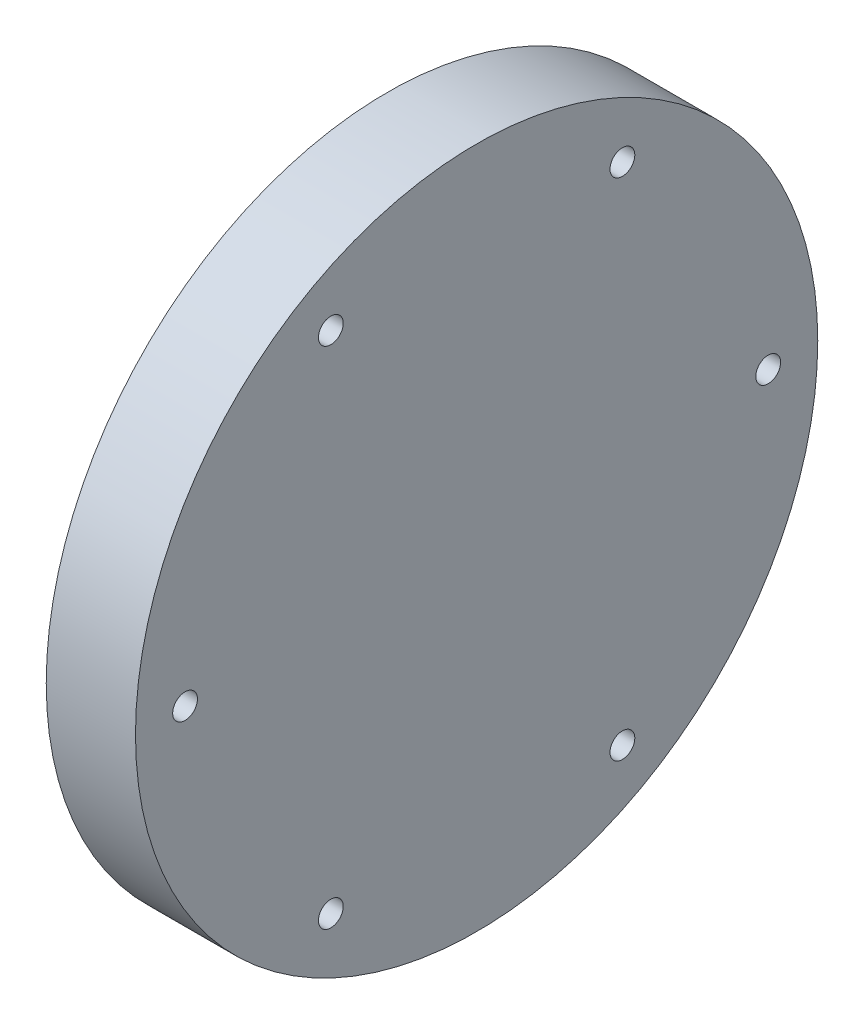
ISO-10303-21;
HEADER;
FILE_DESCRIPTION(('STEP AP214'),'2;1');
FILE_NAME('part.step','',(''),(''),'','','');
FILE_SCHEMA(('AUTOMOTIVE_DESIGN { 1 0 10303 214 1 1 1 1 }'));
ENDSEC;
DATA;
#1=APPLICATION_CONTEXT('core data for automotive mechanical design processes');
#2=APPLICATION_PROTOCOL_DEFINITION('international standard','automotive_design',2000,#1);
#3=PRODUCT_CONTEXT('',#1,'mechanical');
#4=PRODUCT('Part','Part','',(#3));
#5=PRODUCT_RELATED_PRODUCT_CATEGORY('part','',(#4));
#6=PRODUCT_DEFINITION_FORMATION('','',#4);
#7=PRODUCT_DEFINITION_CONTEXT('part definition',#1,'design');
#8=PRODUCT_DEFINITION('design','',#6,#7);
#9=PRODUCT_DEFINITION_SHAPE('','',#8);
#10=(LENGTH_UNIT() NAMED_UNIT(*) SI_UNIT(.MILLI.,.METRE.));
#11=(NAMED_UNIT(*) PLANE_ANGLE_UNIT() SI_UNIT($,.RADIAN.));
#12=(NAMED_UNIT(*) SI_UNIT($,.STERADIAN.) SOLID_ANGLE_UNIT());
#13=UNCERTAINTY_MEASURE_WITH_UNIT(LENGTH_MEASURE(1.E-05),#10,'distance_accuracy_value','');
#14=(GEOMETRIC_REPRESENTATION_CONTEXT(3) GLOBAL_UNCERTAINTY_ASSIGNED_CONTEXT((#13)) GLOBAL_UNIT_ASSIGNED_CONTEXT((#10,
#11,#12)) REPRESENTATION_CONTEXT('',''));
#15=CARTESIAN_POINT('',(0.,0.,0.));
#16=DIRECTION('',(0.,0.,1.));
#17=DIRECTION('',(1.,0.,0.));
#18=AXIS2_PLACEMENT_3D('',#15,#16,#17);
#19=CARTESIAN_POINT('',(159.7,-25.46114687126,-14.7));
#20=DIRECTION('',(1.,0.,0.));
#21=DIRECTION('',(0.,0.,1.));
#22=AXIS2_PLACEMENT_3D('',#19,#20,#21);
#23=CYLINDRICAL_SURFACE('',#22,1.65);
#24=DIRECTION('',(1.,0.,0.));
#25=VECTOR('',#24,1.);
#26=CARTESIAN_POINT('',(159.7,-25.46114687126,-13.05));
#27=LINE('',#26,#25);
#28=CARTESIAN_POINT('',(159.7,-25.46114687126,-13.05));
#29=VERTEX_POINT('',#28);
#30=CARTESIAN_POINT('',(163.7,-25.46114687126,-13.05));
#31=VERTEX_POINT('',#30);
#32=EDGE_CURVE('E62',#29,#31,#27,.T.);
#33=ORIENTED_EDGE('',*,*,#32,.F.);
#34=CARTESIAN_POINT('',(159.7,-25.46114687126,-14.7));
#35=DIRECTION('',(1.,0.,0.));
#36=DIRECTION('',(0.,0.,1.));
#37=AXIS2_PLACEMENT_3D('',#34,#35,#36);
#38=CIRCLE('',#37,1.65);
#39=EDGE_CURVE('E189',#29,#29,#38,.T.);
#40=ORIENTED_EDGE('',*,*,#39,.F.);
#41=ORIENTED_EDGE('',*,*,#32,.T.);
#42=CARTESIAN_POINT('',(163.7,-25.46114687126,-14.7));
#43=DIRECTION('',(1.,0.,0.));
#44=DIRECTION('',(0.,0.,1.));
#45=AXIS2_PLACEMENT_3D('',#42,#43,#44);
#46=CIRCLE('',#45,1.65);
#47=EDGE_CURVE('E158',#31,#31,#46,.T.);
#48=ORIENTED_EDGE('',*,*,#47,.T.);
#49=EDGE_LOOP('',(#33,#40,#41,#48));
#50=FACE_BOUND('',#49,.T.);
#51=ADVANCED_FACE('F40',(#50),#23,.F.);
#52=CARTESIAN_POINT('',(159.7,0.,29.4));
#53=DIRECTION('',(1.,0.,0.));
#54=DIRECTION('',(0.,0.,1.));
#55=AXIS2_PLACEMENT_3D('',#52,#53,#54);
#56=CYLINDRICAL_SURFACE('',#55,1.65);
#57=DIRECTION('',(1.,0.,0.));
#58=VECTOR('',#57,1.);
#59=CARTESIAN_POINT('',(159.7,0.,31.05));
#60=LINE('',#59,#58);
#61=CARTESIAN_POINT('',(159.7,0.,31.05));
#62=VERTEX_POINT('',#61);
#63=CARTESIAN_POINT('',(163.7,0.,31.05));
#64=VERTEX_POINT('',#63);
#65=EDGE_CURVE('E134',#62,#64,#60,.T.);
#66=ORIENTED_EDGE('',*,*,#65,.F.);
#67=CARTESIAN_POINT('',(159.7,0.,29.4));
#68=DIRECTION('',(1.,0.,0.));
#69=DIRECTION('',(0.,0.,1.));
#70=AXIS2_PLACEMENT_3D('',#67,#68,#69);
#71=CIRCLE('',#70,1.65);
#72=EDGE_CURVE('E186',#62,#62,#71,.T.);
#73=ORIENTED_EDGE('',*,*,#72,.F.);
#74=ORIENTED_EDGE('',*,*,#65,.T.);
#75=CARTESIAN_POINT('',(163.7,0.,29.4));
#76=DIRECTION('',(1.,0.,0.));
#77=DIRECTION('',(0.,0.,1.));
#78=AXIS2_PLACEMENT_3D('',#75,#76,#77);
#79=CIRCLE('',#78,1.65);
#80=EDGE_CURVE('E156',#64,#64,#79,.T.);
#81=ORIENTED_EDGE('',*,*,#80,.T.);
#82=EDGE_LOOP('',(#66,#73,#74,#81));
#83=FACE_BOUND('',#82,.T.);
#84=ADVANCED_FACE('F251',(#83),#56,.F.);
#85=CARTESIAN_POINT('',(159.7,0.,0.));
#86=DIRECTION('',(-1.,0.,0.));
#87=DIRECTION('',(0.,0.938443783091679,0.345431999062881));
#88=AXIS2_PLACEMENT_3D('',#85,#86,#87);
#89=CYLINDRICAL_SURFACE('',#88,10.4);
#90=DIRECTION('',(1.,0.,0.));
#91=VECTOR('',#90,1.);
#92=CARTESIAN_POINT('',(159.7,9.759815344154,3.592492790253));
#93=LINE('',#92,#91);
#94=CARTESIAN_POINT('',(159.7,9.759815344154,3.592492790253));
#95=VERTEX_POINT('',#94);
#96=CARTESIAN_POINT('',(163.7,9.759815344154,3.592492790253));
#97=VERTEX_POINT('',#96);
#98=EDGE_CURVE('E126',#95,#97,#93,.T.);
#99=ORIENTED_EDGE('',*,*,#98,.T.);
#100=CARTESIAN_POINT('',(163.7,0.,0.));
#101=DIRECTION('',(-1.,0.,0.));
#102=DIRECTION('',(0.,0.938443783091679,0.345431999062881));
#103=AXIS2_PLACEMENT_3D('',#100,#101,#102);
#104=CIRCLE('',#103,10.4);
#105=CARTESIAN_POINT('',(163.7,9.441507626331,4.360955599628));
#106=VERTEX_POINT('',#105);
#107=EDGE_CURVE('E110',#97,#106,#104,.T.);
#108=ORIENTED_EDGE('',*,*,#107,.T.);
#109=DIRECTION('',(1.,0.,0.));
#110=VECTOR('',#109,1.);
#111=CARTESIAN_POINT('',(159.7,9.441507626331,4.360955599628));
#112=LINE('',#111,#110);
#113=CARTESIAN_POINT('',(159.7,9.441507626331,4.360955599628));
#114=VERTEX_POINT('',#113);
#115=EDGE_CURVE('E135',#114,#106,#112,.T.);
#116=ORIENTED_EDGE('',*,*,#115,.F.);
#117=CARTESIAN_POINT('',(159.7,0.,0.));
#118=DIRECTION('',(-1.,0.,0.));
#119=DIRECTION('',(0.,0.938443783091679,0.345431999062881));
#120=AXIS2_PLACEMENT_3D('',#117,#118,#119);
#121=CIRCLE('',#120,10.4);
#122=EDGE_CURVE('E129',#95,#114,#121,.T.);
#123=ORIENTED_EDGE('',*,*,#122,.F.);
#124=EDGE_LOOP('',(#99,#108,#116,#123));
#125=FACE_BOUND('',#124,.T.);
#126=ADVANCED_FACE('F127',(#125),#89,.T.);
#127=CARTESIAN_POINT('',(159.7,23.461094577293,8.63579997657));
#128=DIRECTION('',(0.,0.345431999062881,-0.938443783091679));
#129=DIRECTION('',(-1.,0.,0.));
#130=AXIS2_PLACEMENT_3D('',#127,#128,#129);
#131=PLANE('',#130);
#132=DIRECTION('',(1.,0.,0.));
#133=VECTOR('',#132,1.);
#134=CARTESIAN_POINT('',(159.7,23.461094577293,8.63579997657));
#135=LINE('',#134,#133);
#136=CARTESIAN_POINT('',(159.7,23.461094577293,8.63579997657));
#137=VERTEX_POINT('',#136);
#138=CARTESIAN_POINT('',(163.7,23.461094577293,8.63579997657));
#139=VERTEX_POINT('',#138);
#140=EDGE_CURVE('E138',#137,#139,#135,.T.);
#141=ORIENTED_EDGE('',*,*,#140,.T.);
#142=DIRECTION('',(0.,-0.938443783091679,-0.345431999062881));
#143=VECTOR('',#142,1.);
#144=CARTESIAN_POINT('',(163.7,23.461094577293,8.63579997657));
#145=LINE('',#144,#143);
#146=EDGE_CURVE('E116',#139,#97,#145,.T.);
#147=ORIENTED_EDGE('',*,*,#146,.T.);
#148=ORIENTED_EDGE('',*,*,#98,.F.);
#149=DIRECTION('',(0.,-0.938443783091679,-0.345431999062881));
#150=VECTOR('',#149,1.);
#151=CARTESIAN_POINT('',(159.7,23.461094577293,8.63579997657));
#152=LINE('',#151,#150);
#153=EDGE_CURVE('E43',#137,#95,#152,.T.);
#154=ORIENTED_EDGE('',*,*,#153,.F.);
#155=EDGE_LOOP('',(#141,#147,#148,#154));
#156=FACE_BOUND('',#155,.T.);
#157=ADVANCED_FACE('F137',(#156),#131,.T.);
#158=CARTESIAN_POINT('',(159.7,9.441507626331,4.360955599628));
#159=DIRECTION('',(0.,-0.419322653809927,0.907837271762842));
#160=DIRECTION('',(-1.,0.,0.));
#161=AXIS2_PLACEMENT_3D('',#158,#159,#160);
#162=PLANE('',#161);
#163=ORIENTED_EDGE('',*,*,#115,.T.);
#164=DIRECTION('',(0.,0.907837271762842,0.419322653809927));
#165=VECTOR('',#164,1.);
#166=CARTESIAN_POINT('',(163.7,9.441507626331,4.360955599628));
#167=LINE('',#166,#165);
#168=CARTESIAN_POINT('',(163.7,22.695931794066,10.483066345259));
#169=VERTEX_POINT('',#168);
#170=EDGE_CURVE('E120',#106,#169,#167,.T.);
#171=ORIENTED_EDGE('',*,*,#170,.T.);
#172=DIRECTION('',(1.,0.,0.));
#173=VECTOR('',#172,1.);
#174=CARTESIAN_POINT('',(159.7,22.695931794066,10.483066345259));
#175=LINE('',#174,#173);
#176=CARTESIAN_POINT('',(159.7,22.695931794066,10.483066345259));
#177=VERTEX_POINT('',#176);
#178=EDGE_CURVE('E162',#177,#169,#175,.T.);
#179=ORIENTED_EDGE('',*,*,#178,.F.);
#180=DIRECTION('',(0.,0.907837271762842,0.419322653809927));
#181=VECTOR('',#180,1.);
#182=CARTESIAN_POINT('',(159.7,9.441507626331,4.360955599628));
#183=LINE('',#182,#181);
#184=EDGE_CURVE('E181',#114,#177,#183,.T.);
#185=ORIENTED_EDGE('',*,*,#184,.F.);
#186=EDGE_LOOP('',(#163,#171,#179,#185));
#187=FACE_BOUND('',#186,.T.);
#188=ADVANCED_FACE('F217',(#187),#162,.T.);
#189=CARTESIAN_POINT('',(159.7,0.,-1.265654248073E-13));
#190=DIRECTION('',(-1.,0.,0.));
#191=DIRECTION('',(0.,0.907837271762842,0.419322653809927));
#192=AXIS2_PLACEMENT_3D('',#189,#190,#191);
#193=CYLINDRICAL_SURFACE('',#192,25.);
#194=ORIENTED_EDGE('',*,*,#178,.T.);
#195=CARTESIAN_POINT('',(163.7,0.,-1.265654248073E-13));
#196=DIRECTION('',(1.,0.,0.));
#197=DIRECTION('',(0.,0.907837271762842,0.419322653809927));
#198=AXIS2_PLACEMENT_3D('',#195,#196,#197);
#199=CIRCLE('',#198,25.);
#200=EDGE_CURVE('E169',#169,#139,#199,.T.);
#201=ORIENTED_EDGE('',*,*,#200,.T.);
#202=ORIENTED_EDGE('',*,*,#140,.F.);
#203=CARTESIAN_POINT('',(159.7,0.,-1.265654248073E-13));
#204=DIRECTION('',(1.,0.,0.));
#205=DIRECTION('',(0.,0.907837271762842,0.419322653809927));
#206=AXIS2_PLACEMENT_3D('',#203,#204,#205);
#207=CIRCLE('',#206,25.);
#208=EDGE_CURVE('E185',#177,#137,#207,.T.);
#209=ORIENTED_EDGE('',*,*,#208,.F.);
#210=EDGE_LOOP('',(#194,#201,#202,#209));
#211=FACE_BOUND('',#210,.T.);
#212=ADVANCED_FACE('F246',(#211),#193,.F.);
#213=CARTESIAN_POINT('',(159.7,25.461146871262,-14.7));
#214=DIRECTION('',(1.,0.,0.));
#215=DIRECTION('',(0.,0.,1.));
#216=AXIS2_PLACEMENT_3D('',#213,#214,#215);
#217=CYLINDRICAL_SURFACE('',#216,1.65);
#218=DIRECTION('',(1.,0.,0.));
#219=VECTOR('',#218,1.);
#220=CARTESIAN_POINT('',(159.7,25.461146871262,-13.05));
#221=LINE('',#220,#219);
#222=CARTESIAN_POINT('',(159.7,25.461146871262,-13.05));
#223=VERTEX_POINT('',#222);
#224=CARTESIAN_POINT('',(163.7,25.461146871262,-13.05));
#225=VERTEX_POINT('',#224);
#226=EDGE_CURVE('E165',#223,#225,#221,.T.);
#227=ORIENTED_EDGE('',*,*,#226,.F.);
#228=CARTESIAN_POINT('',(159.7,25.461146871262,-14.7));
#229=DIRECTION('',(1.,0.,0.));
#230=DIRECTION('',(0.,0.,1.));
#231=AXIS2_PLACEMENT_3D('',#228,#229,#230);
#232=CIRCLE('',#231,1.65);
#233=EDGE_CURVE('E141',#223,#223,#232,.T.);
#234=ORIENTED_EDGE('',*,*,#233,.F.);
#235=ORIENTED_EDGE('',*,*,#226,.T.);
#236=CARTESIAN_POINT('',(163.7,25.461146871262,-14.7));
#237=DIRECTION('',(1.,0.,0.));
#238=DIRECTION('',(0.,0.,1.));
#239=AXIS2_PLACEMENT_3D('',#236,#237,#238);
#240=CIRCLE('',#239,1.65);
#241=EDGE_CURVE('E152',#225,#225,#240,.T.);
#242=ORIENTED_EDGE('',*,*,#241,.T.);
#243=EDGE_LOOP('',(#227,#234,#235,#242));
#244=FACE_BOUND('',#243,.T.);
#245=ADVANCED_FACE('F235',(#244),#217,.F.);
#246=CARTESIAN_POINT('',(159.7,0.,0.));
#247=DIRECTION('',(1.,0.,0.));
#248=DIRECTION('',(0.,1.,0.));
#249=AXIS2_PLACEMENT_3D('',#246,#247,#248);
#250=PLANE('',#249);
#251=ORIENTED_EDGE('',*,*,#39,.T.);
#252=EDGE_LOOP('',(#251));
#253=FACE_BOUND('',#252,.T.);
#254=ORIENTED_EDGE('',*,*,#72,.T.);
#255=EDGE_LOOP('',(#254));
#256=FACE_BOUND('',#255,.T.);
#257=ORIENTED_EDGE('',*,*,#153,.T.);
#258=ORIENTED_EDGE('',*,*,#122,.T.);
#259=ORIENTED_EDGE('',*,*,#184,.T.);
#260=ORIENTED_EDGE('',*,*,#208,.T.);
#261=EDGE_LOOP('',(#257,#258,#259,#260));
#262=FACE_BOUND('',#261,.T.);
#263=ORIENTED_EDGE('',*,*,#233,.T.);
#264=EDGE_LOOP('',(#263));
#265=FACE_BOUND('',#264,.T.);
#266=CARTESIAN_POINT('',(159.7,0.,0.));
#267=DIRECTION('',(1.,0.,0.));
#268=DIRECTION('',(0.,0.,1.));
#269=AXIS2_PLACEMENT_3D('',#266,#267,#268);
#270=CIRCLE('',#269,34.4);
#271=CARTESIAN_POINT('',(159.7,0.,34.4));
#272=VERTEX_POINT('',#271);
#273=EDGE_CURVE('E171',#272,#272,#270,.T.);
#274=ORIENTED_EDGE('',*,*,#273,.F.);
#275=EDGE_LOOP('',(#274));
#276=FACE_BOUND('',#275,.T.);
#277=ADVANCED_FACE('F233',(#253,#256,#262,#265,#276),#250,.F.);
#278=CARTESIAN_POINT('',(159.7,0.,0.));
#279=DIRECTION('',(1.,0.,0.));
#280=DIRECTION('',(0.,0.,1.));
#281=AXIS2_PLACEMENT_3D('',#278,#279,#280);
#282=CYLINDRICAL_SURFACE('',#281,34.4);
#283=DIRECTION('',(1.,0.,0.));
#284=VECTOR('',#283,1.);
#285=CARTESIAN_POINT('',(159.7,0.,34.4));
#286=LINE('',#285,#284);
#287=CARTESIAN_POINT('',(163.7,0.,34.4));
#288=VERTEX_POINT('',#287);
#289=EDGE_CURVE('E161',#272,#288,#286,.T.);
#290=ORIENTED_EDGE('',*,*,#289,.T.);
#291=ORIENTED_EDGE('',*,*,#289,.F.);
#292=ORIENTED_EDGE('',*,*,#273,.T.);
#293=EDGE_LOOP('',(#290,#291,#292));
#294=FACE_BOUND('',#293,.T.);
#295=CARTESIAN_POINT('',(168.7,0.,0.));
#296=DIRECTION('',(-1.,0.,0.));
#297=DIRECTION('',(0.,0.,1.));
#298=AXIS2_PLACEMENT_3D('',#295,#296,#297);
#299=CIRCLE('',#298,34.4);
#300=CARTESIAN_POINT('',(168.7,0.,34.4));
#301=VERTEX_POINT('',#300);
#302=EDGE_CURVE('E157',#301,#301,#299,.T.);
#303=ORIENTED_EDGE('',*,*,#302,.T.);
#304=EDGE_LOOP('',(#303));
#305=FACE_BOUND('',#304,.T.);
#306=ADVANCED_FACE('F229',(#294,#305),#282,.T.);
#307=CARTESIAN_POINT('',(168.7,0.,29.4));
#308=DIRECTION('',(-1.,0.,0.));
#309=DIRECTION('',(0.,0.,1.));
#310=AXIS2_PLACEMENT_3D('',#307,#308,#309);
#311=CYLINDRICAL_SURFACE('',#310,1.25);
#312=CARTESIAN_POINT('',(168.7,0.,29.4));
#313=DIRECTION('',(1.,0.,0.));
#314=DIRECTION('',(0.,0.,-1.));
#315=AXIS2_PLACEMENT_3D('',#312,#313,#314);
#316=CIRCLE('',#315,1.25);
#317=CARTESIAN_POINT('',(168.7,0.,28.15));
#318=VERTEX_POINT('',#317);
#319=EDGE_CURVE('E310',#318,#318,#316,.T.);
#320=ORIENTED_EDGE('',*,*,#319,.T.);
#321=EDGE_LOOP('',(#320));
#322=FACE_BOUND('',#321,.T.);
#323=CARTESIAN_POINT('',(163.7,0.,29.4));
#324=DIRECTION('',(1.,0.,0.));
#325=DIRECTION('',(0.,0.,-1.));
#326=AXIS2_PLACEMENT_3D('',#323,#324,#325);
#327=CIRCLE('',#326,1.25);
#328=CARTESIAN_POINT('',(163.7,0.,28.15));
#329=VERTEX_POINT('',#328);
#330=EDGE_CURVE('E313',#329,#329,#327,.F.);
#331=ORIENTED_EDGE('',*,*,#330,.T.);
#332=EDGE_LOOP('',(#331));
#333=FACE_BOUND('',#332,.T.);
#334=ADVANCED_FACE('F243',(#322,#333),#311,.F.);
#335=CARTESIAN_POINT('',(168.7,-25.4611468712625,14.7));
#336=DIRECTION('',(-1.,0.,0.));
#337=DIRECTION('',(0.,0.,1.));
#338=AXIS2_PLACEMENT_3D('',#335,#336,#337);
#339=CYLINDRICAL_SURFACE('',#338,1.25);
#340=CARTESIAN_POINT('',(168.7,-25.4611468712625,14.7));
#341=DIRECTION('',(1.,0.,0.));
#342=DIRECTION('',(0.,0.,-1.));
#343=AXIS2_PLACEMENT_3D('',#340,#341,#342);
#344=CIRCLE('',#343,1.25);
#345=CARTESIAN_POINT('',(168.7,-25.4611468712625,13.45));
#346=VERTEX_POINT('',#345);
#347=EDGE_CURVE('E337',#346,#346,#344,.T.);
#348=ORIENTED_EDGE('',*,*,#347,.T.);
#349=EDGE_LOOP('',(#348));
#350=FACE_BOUND('',#349,.T.);
#351=CARTESIAN_POINT('',(163.7,-25.4611468712625,14.7));
#352=DIRECTION('',(1.,0.,0.));
#353=DIRECTION('',(0.,0.,-1.));
#354=AXIS2_PLACEMENT_3D('',#351,#352,#353);
#355=CIRCLE('',#354,1.25);
#356=CARTESIAN_POINT('',(163.7,-25.4611468712625,13.45));
#357=VERTEX_POINT('',#356);
#358=EDGE_CURVE('E11',#357,#357,#355,.F.);
#359=ORIENTED_EDGE('',*,*,#358,.T.);
#360=EDGE_LOOP('',(#359));
#361=FACE_BOUND('',#360,.T.);
#362=ADVANCED_FACE('F292',(#350,#361),#339,.F.);
#363=CARTESIAN_POINT('',(168.7,-25.4611468712625,-14.7));
#364=DIRECTION('',(-1.,0.,0.));
#365=DIRECTION('',(0.,0.,1.));
#366=AXIS2_PLACEMENT_3D('',#363,#364,#365);
#367=CYLINDRICAL_SURFACE('',#366,1.25);
#368=CARTESIAN_POINT('',(168.7,-25.4611468712625,-14.7));
#369=DIRECTION('',(1.,0.,0.));
#370=DIRECTION('',(0.,0.,-1.));
#371=AXIS2_PLACEMENT_3D('',#368,#369,#370);
#372=CIRCLE('',#371,1.25);
#373=CARTESIAN_POINT('',(168.7,-25.4611468712625,-15.95));
#374=VERTEX_POINT('',#373);
#375=EDGE_CURVE('E330',#374,#374,#372,.T.);
#376=ORIENTED_EDGE('',*,*,#375,.T.);
#377=EDGE_LOOP('',(#376));
#378=FACE_BOUND('',#377,.T.);
#379=CARTESIAN_POINT('',(163.7,-25.4611468712625,-14.7));
#380=DIRECTION('',(1.,0.,0.));
#381=DIRECTION('',(0.,0.,-1.));
#382=AXIS2_PLACEMENT_3D('',#379,#380,#381);
#383=CIRCLE('',#382,1.25);
#384=CARTESIAN_POINT('',(163.7,-25.4611468712625,-15.95));
#385=VERTEX_POINT('',#384);
#386=EDGE_CURVE('E315',#385,#385,#383,.F.);
#387=ORIENTED_EDGE('',*,*,#386,.T.);
#388=EDGE_LOOP('',(#387));
#389=FACE_BOUND('',#388,.T.);
#390=ADVANCED_FACE('F288',(#378,#389),#367,.F.);
#391=CARTESIAN_POINT('',(168.7,25.4611468712625,-14.7));
#392=DIRECTION('',(-1.,0.,0.));
#393=DIRECTION('',(0.,0.,1.));
#394=AXIS2_PLACEMENT_3D('',#391,#392,#393);
#395=CYLINDRICAL_SURFACE('',#394,1.25);
#396=CARTESIAN_POINT('',(168.7,25.4611468712625,-14.7));
#397=DIRECTION('',(1.,0.,0.));
#398=DIRECTION('',(0.,0.,-1.));
#399=AXIS2_PLACEMENT_3D('',#396,#397,#398);
#400=CIRCLE('',#399,1.25);
#401=CARTESIAN_POINT('',(168.7,25.4611468712625,-15.95));
#402=VERTEX_POINT('',#401);
#403=EDGE_CURVE('E327',#402,#402,#400,.T.);
#404=ORIENTED_EDGE('',*,*,#403,.T.);
#405=EDGE_LOOP('',(#404));
#406=FACE_BOUND('',#405,.T.);
#407=CARTESIAN_POINT('',(163.7,25.4611468712625,-14.7));
#408=DIRECTION('',(1.,0.,0.));
#409=DIRECTION('',(0.,0.,-1.));
#410=AXIS2_PLACEMENT_3D('',#407,#408,#409);
#411=CIRCLE('',#410,1.25);
#412=CARTESIAN_POINT('',(163.7,25.4611468712625,-15.95));
#413=VERTEX_POINT('',#412);
#414=EDGE_CURVE('E318',#413,#413,#411,.F.);
#415=ORIENTED_EDGE('',*,*,#414,.T.);
#416=EDGE_LOOP('',(#415));
#417=FACE_BOUND('',#416,.T.);
#418=ADVANCED_FACE('F284',(#406,#417),#395,.F.);
#419=CARTESIAN_POINT('',(168.7,0.,-29.4));
#420=DIRECTION('',(-1.,0.,0.));
#421=DIRECTION('',(0.,0.,1.));
#422=AXIS2_PLACEMENT_3D('',#419,#420,#421);
#423=CYLINDRICAL_SURFACE('',#422,1.25);
#424=CARTESIAN_POINT('',(168.7,0.,-29.4));
#425=DIRECTION('',(1.,0.,0.));
#426=DIRECTION('',(0.,0.,-1.));
#427=AXIS2_PLACEMENT_3D('',#424,#425,#426);
#428=CIRCLE('',#427,1.25);
#429=CARTESIAN_POINT('',(168.7,0.,-30.65));
#430=VERTEX_POINT('',#429);
#431=EDGE_CURVE('E331',#430,#430,#428,.T.);
#432=ORIENTED_EDGE('',*,*,#431,.T.);
#433=EDGE_LOOP('',(#432));
#434=FACE_BOUND('',#433,.T.);
#435=CARTESIAN_POINT('',(163.7,0.,-29.4));
#436=DIRECTION('',(1.,0.,0.));
#437=DIRECTION('',(0.,0.,-1.));
#438=AXIS2_PLACEMENT_3D('',#435,#436,#437);
#439=CIRCLE('',#438,1.25);
#440=CARTESIAN_POINT('',(163.7,0.,-30.65));
#441=VERTEX_POINT('',#440);
#442=EDGE_CURVE('E49',#441,#441,#439,.F.);
#443=ORIENTED_EDGE('',*,*,#442,.T.);
#444=EDGE_LOOP('',(#443));
#445=FACE_BOUND('',#444,.T.);
#446=ADVANCED_FACE('F287',(#434,#445),#423,.F.);
#447=CARTESIAN_POINT('',(168.7,25.4611468712625,14.7));
#448=DIRECTION('',(-1.,0.,0.));
#449=DIRECTION('',(0.,0.,1.));
#450=AXIS2_PLACEMENT_3D('',#447,#448,#449);
#451=CYLINDRICAL_SURFACE('',#450,1.25);
#452=CARTESIAN_POINT('',(168.7,25.4611468712625,14.7));
#453=DIRECTION('',(1.,0.,0.));
#454=DIRECTION('',(0.,0.,-1.));
#455=AXIS2_PLACEMENT_3D('',#452,#453,#454);
#456=CIRCLE('',#455,1.25);
#457=CARTESIAN_POINT('',(168.7,25.4611468712625,13.45));
#458=VERTEX_POINT('',#457);
#459=EDGE_CURVE('E334',#458,#458,#456,.T.);
#460=ORIENTED_EDGE('',*,*,#459,.T.);
#461=EDGE_LOOP('',(#460));
#462=FACE_BOUND('',#461,.T.);
#463=CARTESIAN_POINT('',(163.7,25.4611468712625,14.7));
#464=DIRECTION('',(1.,0.,0.));
#465=DIRECTION('',(0.,0.,-1.));
#466=AXIS2_PLACEMENT_3D('',#463,#464,#465);
#467=CIRCLE('',#466,1.25);
#468=CARTESIAN_POINT('',(163.7,25.4611468712625,13.45));
#469=VERTEX_POINT('',#468);
#470=EDGE_CURVE('E178',#469,#469,#467,.F.);
#471=ORIENTED_EDGE('',*,*,#470,.T.);
#472=EDGE_LOOP('',(#471));
#473=FACE_BOUND('',#472,.T.);
#474=ADVANCED_FACE('F282',(#462,#473),#451,.F.);
#475=CARTESIAN_POINT('',(168.7,0.,0.));
#476=DIRECTION('',(-1.,0.,0.));
#477=DIRECTION('',(0.,0.,1.));
#478=AXIS2_PLACEMENT_3D('',#475,#476,#477);
#479=PLANE('',#478);
#480=ORIENTED_EDGE('',*,*,#319,.F.);
#481=EDGE_LOOP('',(#480));
#482=FACE_BOUND('',#481,.T.);
#483=ORIENTED_EDGE('',*,*,#347,.F.);
#484=EDGE_LOOP('',(#483));
#485=FACE_BOUND('',#484,.T.);
#486=ORIENTED_EDGE('',*,*,#375,.F.);
#487=EDGE_LOOP('',(#486));
#488=FACE_BOUND('',#487,.T.);
#489=ORIENTED_EDGE('',*,*,#403,.F.);
#490=EDGE_LOOP('',(#489));
#491=FACE_BOUND('',#490,.T.);
#492=ORIENTED_EDGE('',*,*,#431,.F.);
#493=EDGE_LOOP('',(#492));
#494=FACE_BOUND('',#493,.T.);
#495=ORIENTED_EDGE('',*,*,#459,.F.);
#496=EDGE_LOOP('',(#495));
#497=FACE_BOUND('',#496,.T.);
#498=ORIENTED_EDGE('',*,*,#302,.F.);
#499=EDGE_LOOP('',(#498));
#500=FACE_BOUND('',#499,.T.);
#501=ADVANCED_FACE('F277',(#482,#485,#488,#491,#494,#497,#500),#479,.F.);
#502=CARTESIAN_POINT('',(163.7,34.4,0.));
#503=DIRECTION('',(1.,0.,0.));
#504=DIRECTION('',(0.,0.,-1.));
#505=AXIS2_PLACEMENT_3D('',#502,#503,#504);
#506=PLANE('',#505);
#507=ORIENTED_EDGE('',*,*,#241,.F.);
#508=EDGE_LOOP('',(#507));
#509=FACE_BOUND('',#508,.T.);
#510=ORIENTED_EDGE('',*,*,#414,.F.);
#511=EDGE_LOOP('',(#510));
#512=FACE_BOUND('',#511,.T.);
#513=ADVANCED_FACE('F273',(#509,#512),#506,.F.);
#514=ORIENTED_EDGE('',*,*,#80,.F.);
#515=EDGE_LOOP('',(#514));
#516=FACE_BOUND('',#515,.T.);
#517=ORIENTED_EDGE('',*,*,#330,.F.);
#518=EDGE_LOOP('',(#517));
#519=FACE_BOUND('',#518,.T.);
#520=ADVANCED_FACE('F276',(#516,#519),#506,.F.);
#521=ORIENTED_EDGE('',*,*,#47,.F.);
#522=EDGE_LOOP('',(#521));
#523=FACE_BOUND('',#522,.T.);
#524=ORIENTED_EDGE('',*,*,#386,.F.);
#525=EDGE_LOOP('',(#524));
#526=FACE_BOUND('',#525,.T.);
#527=ADVANCED_FACE('F279',(#523,#526),#506,.F.);
#528=CARTESIAN_POINT('',(163.7,0.,0.));
#529=DIRECTION('',(1.,0.,0.));
#530=DIRECTION('',(0.,1.,0.));
#531=AXIS2_PLACEMENT_3D('',#528,#529,#530);
#532=PLANE('',#531);
#533=ORIENTED_EDGE('',*,*,#470,.F.);
#534=EDGE_LOOP('',(#533));
#535=FACE_BOUND('',#534,.T.);
#536=ADVANCED_FACE('F272',(#535),#532,.T.);
#537=ORIENTED_EDGE('',*,*,#442,.F.);
#538=EDGE_LOOP('',(#537));
#539=FACE_BOUND('',#538,.T.);
#540=ADVANCED_FACE('F270',(#539),#532,.T.);
#541=ORIENTED_EDGE('',*,*,#358,.F.);
#542=EDGE_LOOP('',(#541));
#543=FACE_BOUND('',#542,.T.);
#544=ADVANCED_FACE('F267',(#543),#532,.T.);
#545=ORIENTED_EDGE('',*,*,#200,.F.);
#546=ORIENTED_EDGE('',*,*,#170,.F.);
#547=ORIENTED_EDGE('',*,*,#107,.F.);
#548=ORIENTED_EDGE('',*,*,#146,.F.);
#549=EDGE_LOOP('',(#545,#546,#547,#548));
#550=FACE_BOUND('',#549,.T.);
#551=ADVANCED_FACE('F113',(#550),#506,.F.);
#552=CLOSED_SHELL('',(#51,#84,#126,#157,#188,#212,#245,#277,#306,#334,#362,#390,#418,#446,#474,
#501,#513,#520,#527,#536,#540,#544,#551));
#553=MANIFOLD_SOLID_BREP('B2',#552);
#554=ADVANCED_BREP_SHAPE_REPRESENTATION('',(#18,#553),#14);
#555=SHAPE_DEFINITION_REPRESENTATION(#9,#554);
ENDSEC;
END-ISO-10303-21;
